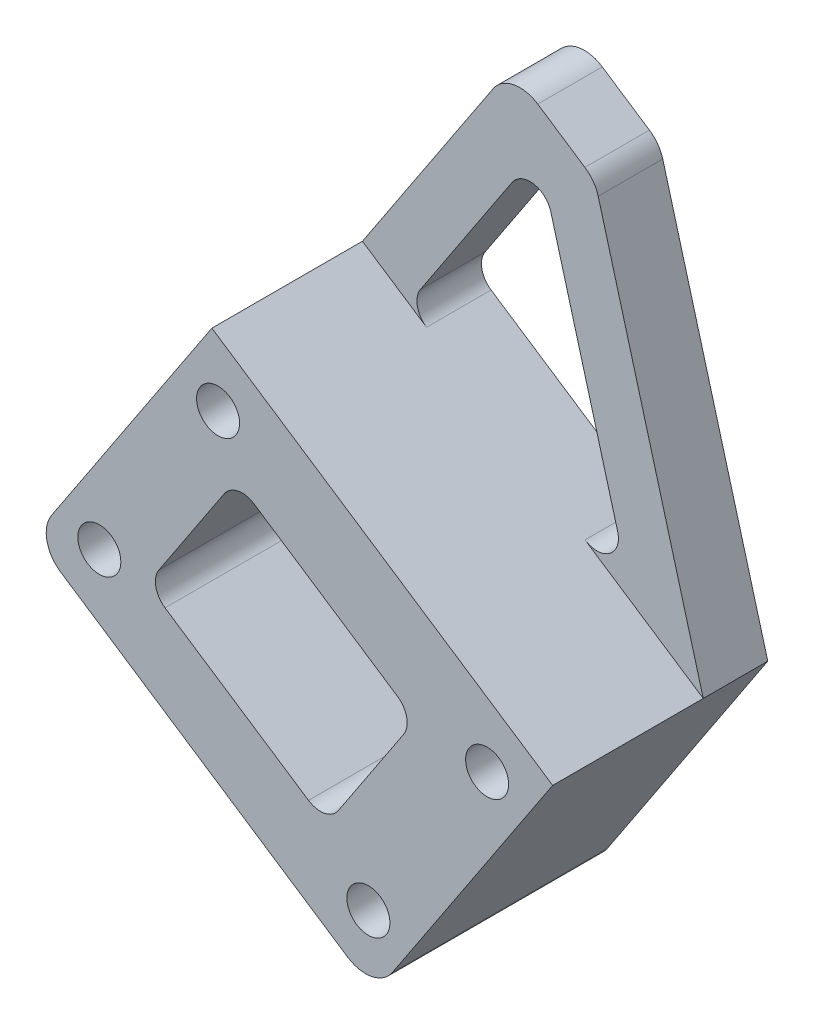
ISO-10303-21;
HEADER;
FILE_DESCRIPTION(('STEP AP214'),'2;1');
FILE_NAME('part.step','',(''),(''),'','','');
FILE_SCHEMA(('AUTOMOTIVE_DESIGN { 1 0 10303 214 1 1 1 1 }'));
ENDSEC;
DATA;
#1=APPLICATION_CONTEXT('core data for automotive mechanical design processes');
#2=APPLICATION_PROTOCOL_DEFINITION('international standard','automotive_design',2000,#1);
#3=PRODUCT_CONTEXT('',#1,'mechanical');
#4=PRODUCT('Part','Part','',(#3));
#5=PRODUCT_RELATED_PRODUCT_CATEGORY('part','',(#4));
#6=PRODUCT_DEFINITION_FORMATION('','',#4);
#7=PRODUCT_DEFINITION_CONTEXT('part definition',#1,'design');
#8=PRODUCT_DEFINITION('design','',#6,#7);
#9=PRODUCT_DEFINITION_SHAPE('','',#8);
#10=(LENGTH_UNIT() NAMED_UNIT(*) SI_UNIT(.MILLI.,.METRE.));
#11=(NAMED_UNIT(*) PLANE_ANGLE_UNIT() SI_UNIT($,.RADIAN.));
#12=(NAMED_UNIT(*) SI_UNIT($,.STERADIAN.) SOLID_ANGLE_UNIT());
#13=UNCERTAINTY_MEASURE_WITH_UNIT(LENGTH_MEASURE(1.E-05),#10,'distance_accuracy_value','');
#14=(GEOMETRIC_REPRESENTATION_CONTEXT(3) GLOBAL_UNCERTAINTY_ASSIGNED_CONTEXT((#13)) GLOBAL_UNIT_ASSIGNED_CONTEXT((#10,
#11,#12)) REPRESENTATION_CONTEXT('',''));
#15=CARTESIAN_POINT('',(0.,0.,0.));
#16=DIRECTION('',(0.,0.,1.));
#17=DIRECTION('',(1.,0.,0.));
#18=AXIS2_PLACEMENT_3D('',#15,#16,#17);
#19=CARTESIAN_POINT('',(23.5441511878888,-8.40208816576704,20.));
#20=DIRECTION('',(-0.964284087030584,-0.264870155924735,0.));
#21=DIRECTION('',(0.264870155924735,-0.964284087030584,0.));
#22=AXIS2_PLACEMENT_3D('',#19,#20,#21);
#23=PLANE('',#22);
#24=DIRECTION('',(-0.264870155924735,0.964284087030584,0.));
#25=VECTOR('',#24,1.);
#26=CARTESIAN_POINT('',(23.5441511878888,-8.40208816576704,6.));
#27=LINE('',#26,#25);
#28=CARTESIAN_POINT('',(23.5441511878888,-8.40208816576704,6.));
#29=VERTEX_POINT('',#28);
#30=CARTESIAN_POINT('',(13.7775427468694,27.154145306643,6.));
#31=VERTEX_POINT('',#30);
#32=EDGE_CURVE('E245',#29,#31,#27,.T.);
#33=ORIENTED_EDGE('',*,*,#32,.F.);
#34=DIRECTION('',(0.,0.,-1.));
#35=VECTOR('',#34,1.);
#36=CARTESIAN_POINT('',(23.5441511878888,-8.40208816576704,20.));
#37=LINE('',#36,#35);
#38=CARTESIAN_POINT('',(23.5441511878888,-8.40208816576704,0.));
#39=VERTEX_POINT('',#38);
#40=EDGE_CURVE('E411',#29,#39,#37,.T.);
#41=ORIENTED_EDGE('',*,*,#40,.T.);
#42=DIRECTION('',(-0.264870155924735,0.964284087030584,0.));
#43=VECTOR('',#42,1.);
#44=CARTESIAN_POINT('',(23.5441511878888,-8.40208816576704,0.));
#45=LINE('',#44,#43);
#46=CARTESIAN_POINT('',(13.7775427468694,27.154145306643,0.));
#47=VERTEX_POINT('',#46);
#48=EDGE_CURVE('E379',#39,#47,#45,.T.);
#49=ORIENTED_EDGE('',*,*,#48,.T.);
#50=DIRECTION('',(0.,0.,-1.));
#51=VECTOR('',#50,1.);
#52=CARTESIAN_POINT('',(13.7775427468694,27.154145306643,20.));
#53=LINE('',#52,#51);
#54=EDGE_CURVE('E410',#31,#47,#53,.T.);
#55=ORIENTED_EDGE('',*,*,#54,.F.);
#56=EDGE_LOOP('',(#33,#41,#49,#55));
#57=FACE_BOUND('',#56,.T.);
#58=ADVANCED_FACE('F41',(#57),#23,.F.);
#59=CARTESIAN_POINT('',(10.8846904857777,26.3595348388687,20.));
#60=DIRECTION('',(0.,0.,-1.));
#61=DIRECTION('',(-1.,0.,0.));
#62=AXIS2_PLACEMENT_3D('',#59,#60,#61);
#63=CYLINDRICAL_SURFACE('',#62,3.00000000000002);
#64=CARTESIAN_POINT('',(10.8846904857777,26.3595348388687,6.));
#65=DIRECTION('',(0.,0.,1.));
#66=DIRECTION('',(1.,0.,0.));
#67=AXIS2_PLACEMENT_3D('',#64,#65,#66);
#68=CIRCLE('',#67,3.00000000000002);
#69=CARTESIAN_POINT('',(12.5405014417147,28.8611923050697,6.));
#70=VERTEX_POINT('',#69);
#71=EDGE_CURVE('E243',#31,#70,#68,.T.);
#72=ORIENTED_EDGE('',*,*,#71,.F.);
#73=ORIENTED_EDGE('',*,*,#54,.T.);
#74=CARTESIAN_POINT('',(10.8846904857777,26.3595348388687,0.));
#75=DIRECTION('',(0.,0.,1.));
#76=DIRECTION('',(1.,0.,0.));
#77=AXIS2_PLACEMENT_3D('',#74,#75,#76);
#78=CIRCLE('',#77,3.00000000000002);
#79=CARTESIAN_POINT('',(12.5405014417147,28.8611923050697,0.));
#80=VERTEX_POINT('',#79);
#81=EDGE_CURVE('E382',#47,#80,#78,.T.);
#82=ORIENTED_EDGE('',*,*,#81,.T.);
#83=DIRECTION('',(0.,0.,-1.));
#84=VECTOR('',#83,1.);
#85=CARTESIAN_POINT('',(12.5405014417147,28.8611923050697,20.));
#86=LINE('',#85,#84);
#87=EDGE_CURVE('E408',#70,#80,#86,.T.);
#88=ORIENTED_EDGE('',*,*,#87,.F.);
#89=EDGE_LOOP('',(#72,#73,#82,#88));
#90=FACE_BOUND('',#89,.T.);
#91=ADVANCED_FACE('F432',(#90),#63,.T.);
#92=CARTESIAN_POINT('',(12.5405014417147,28.8611923050697,20.));
#93=DIRECTION('',(-0.551936985312337,-0.833885822066984,0.));
#94=DIRECTION('',(0.833885822066984,-0.551936985312337,0.));
#95=AXIS2_PLACEMENT_3D('',#92,#93,#94);
#96=PLANE('',#95);
#97=DIRECTION('',(-0.833885822066984,0.551936985312337,0.));
#98=VECTOR('',#97,1.);
#99=CARTESIAN_POINT('',(12.5405014417147,28.8611923050697,6.));
#100=LINE('',#99,#98);
#101=CARTESIAN_POINT('',(8.15657204835288,31.7628518718394,6.));
#102=VERTEX_POINT('',#101);
#103=EDGE_CURVE('E241',#70,#102,#100,.T.);
#104=ORIENTED_EDGE('',*,*,#103,.F.);
#105=ORIENTED_EDGE('',*,*,#87,.T.);
#106=DIRECTION('',(-0.833885822066983,0.551936985312337,0.));
#107=VECTOR('',#106,1.);
#108=CARTESIAN_POINT('',(12.5405014417147,28.8611923050697,0.));
#109=LINE('',#108,#107);
#110=CARTESIAN_POINT('',(8.15657204835288,31.7628518718394,0.));
#111=VERTEX_POINT('',#110);
#112=EDGE_CURVE('E385',#80,#111,#109,.T.);
#113=ORIENTED_EDGE('',*,*,#112,.T.);
#114=DIRECTION('',(0.,0.,-1.));
#115=VECTOR('',#114,1.);
#116=CARTESIAN_POINT('',(8.15657204835288,31.7628518718394,20.));
#117=LINE('',#116,#115);
#118=EDGE_CURVE('E406',#102,#111,#117,.T.);
#119=ORIENTED_EDGE('',*,*,#118,.F.);
#120=EDGE_LOOP('',(#104,#105,#113,#119));
#121=FACE_BOUND('',#120,.T.);
#122=ADVANCED_FACE('F436',(#121),#96,.F.);
#123=CARTESIAN_POINT('',(6.50076109241587,29.2611944056385,20.));
#124=DIRECTION('',(0.,0.,-1.));
#125=DIRECTION('',(-1.,0.,0.));
#126=AXIS2_PLACEMENT_3D('',#123,#124,#125);
#127=CYLINDRICAL_SURFACE('',#126,2.99999999999996);
#128=CARTESIAN_POINT('',(6.50076109241587,29.2611944056385,6.));
#129=DIRECTION('',(0.,0.,1.));
#130=DIRECTION('',(1.,0.,0.));
#131=AXIS2_PLACEMENT_3D('',#128,#129,#130);
#132=CIRCLE('',#131,2.99999999999996);
#133=CARTESIAN_POINT('',(3.99910362621493,30.9170053615754,6.));
#134=VERTEX_POINT('',#133);
#135=EDGE_CURVE('E208',#102,#134,#132,.T.);
#136=ORIENTED_EDGE('',*,*,#135,.F.);
#137=ORIENTED_EDGE('',*,*,#118,.T.);
#138=CARTESIAN_POINT('',(6.50076109241587,29.2611944056385,0.));
#139=DIRECTION('',(0.,0.,1.));
#140=DIRECTION('',(1.,0.,0.));
#141=AXIS2_PLACEMENT_3D('',#138,#139,#140);
#142=CIRCLE('',#141,2.99999999999996);
#143=CARTESIAN_POINT('',(3.99910362621494,30.9170053615754,0.));
#144=VERTEX_POINT('',#143);
#145=EDGE_CURVE('E388',#111,#144,#142,.T.);
#146=ORIENTED_EDGE('',*,*,#145,.T.);
#147=DIRECTION('',(0.,0.,-1.));
#148=VECTOR('',#147,1.);
#149=CARTESIAN_POINT('',(3.99910362621494,30.9170053615754,20.));
#150=LINE('',#149,#148);
#151=EDGE_CURVE('E404',#134,#144,#150,.T.);
#152=ORIENTED_EDGE('',*,*,#151,.F.);
#153=EDGE_LOOP('',(#136,#137,#146,#152));
#154=FACE_BOUND('',#153,.T.);
#155=ADVANCED_FACE('F438',(#154),#127,.T.);
#156=CARTESIAN_POINT('',(13.6578409145248,0.539927744348745,20.));
#157=DIRECTION('',(0.,0.,-1.));
#158=DIRECTION('',(-1.,0.,0.));
#159=AXIS2_PLACEMENT_3D('',#156,#157,#158);
#160=CYLINDRICAL_SURFACE('',#159,2.00000000000001);
#161=DIRECTION('',(0.,0.,-1.));
#162=VECTOR('',#161,1.);
#163=CARTESIAN_POINT('',(12.5539669439001,-1.12784389978526,20.));
#164=LINE('',#163,#162);
#165=CARTESIAN_POINT('',(12.5539669439001,-1.12784389978525,6.));
#166=VERTEX_POINT('',#165);
#167=CARTESIAN_POINT('',(12.5539669439001,-1.12784389978526,0.));
#168=VERTEX_POINT('',#167);
#169=EDGE_CURVE('E64',#166,#168,#164,.T.);
#170=ORIENTED_EDGE('',*,*,#169,.F.);
#171=CARTESIAN_POINT('',(13.6578409145248,0.539927744348745,6.));
#172=DIRECTION('',(0.,0.,1.));
#173=DIRECTION('',(1.,0.,0.));
#174=AXIS2_PLACEMENT_3D('',#171,#172,#173);
#175=CIRCLE('',#174,2.00000000000001);
#176=CARTESIAN_POINT('',(15.5864090885859,1.06966805619818,6.));
#177=VERTEX_POINT('',#176);
#178=EDGE_CURVE('E212',#166,#177,#175,.T.);
#179=ORIENTED_EDGE('',*,*,#178,.T.);
#180=DIRECTION('',(0.,0.,-1.));
#181=VECTOR('',#180,1.);
#182=CARTESIAN_POINT('',(15.5864090885859,1.06966805619818,20.));
#183=LINE('',#182,#181);
#184=CARTESIAN_POINT('',(15.5864090885859,1.06966805619818,0.));
#185=VERTEX_POINT('',#184);
#186=EDGE_CURVE('E281',#177,#185,#183,.T.);
#187=ORIENTED_EDGE('',*,*,#186,.T.);
#188=CARTESIAN_POINT('',(13.6578409145248,0.539927744348745,0.));
#189=DIRECTION('',(0.,0.,1.));
#190=DIRECTION('',(1.,0.,0.));
#191=AXIS2_PLACEMENT_3D('',#188,#189,#190);
#192=CIRCLE('',#191,2.00000000000001);
#193=EDGE_CURVE('E251',#168,#185,#192,.T.);
#194=ORIENTED_EDGE('',*,*,#193,.F.);
#195=EDGE_LOOP('',(#170,#179,#187,#194));
#196=FACE_BOUND('',#195,.T.);
#197=ADVANCED_FACE('F503',(#196),#160,.F.);
#198=CARTESIAN_POINT('',(15.5864090885859,1.06966805619818,20.));
#199=DIRECTION('',(-0.964284087030584,-0.264870155924734,0.));
#200=DIRECTION('',(0.264870155924734,-0.964284087030584,0.));
#201=AXIS2_PLACEMENT_3D('',#198,#199,#200);
#202=PLANE('',#201);
#203=ORIENTED_EDGE('',*,*,#186,.F.);
#204=DIRECTION('',(-0.264870155924734,0.964284087030584,0.));
#205=VECTOR('',#204,1.);
#206=CARTESIAN_POINT('',(15.5864090885859,1.06966805619818,6.));
#207=LINE('',#206,#205);
#208=CARTESIAN_POINT('',(9.37146421885764,23.6957446661818,6.));
#209=VERTEX_POINT('',#208);
#210=EDGE_CURVE('E235',#177,#209,#207,.T.);
#211=ORIENTED_EDGE('',*,*,#210,.T.);
#212=DIRECTION('',(0.,0.,-1.));
#213=VECTOR('',#212,1.);
#214=CARTESIAN_POINT('',(9.37146421885764,23.6957446661818,20.));
#215=LINE('',#214,#213);
#216=CARTESIAN_POINT('',(9.37146421885764,23.6957446661818,0.));
#217=VERTEX_POINT('',#216);
#218=EDGE_CURVE('E279',#209,#217,#215,.T.);
#219=ORIENTED_EDGE('',*,*,#218,.T.);
#220=DIRECTION('',(-0.264870155924734,0.964284087030584,0.));
#221=VECTOR('',#220,1.);
#222=CARTESIAN_POINT('',(15.5864090885859,1.06966805619818,0.));
#223=LINE('',#222,#221);
#224=EDGE_CURVE('E259',#185,#217,#223,.T.);
#225=ORIENTED_EDGE('',*,*,#224,.F.);
#226=EDGE_LOOP('',(#203,#211,#219,#225));
#227=FACE_BOUND('',#226,.T.);
#228=ADVANCED_FACE('F519',(#227),#202,.T.);
#229=CARTESIAN_POINT('',(7.44289604479648,23.1660043543324,20.));
#230=DIRECTION('',(0.,0.,-1.));
#231=DIRECTION('',(-1.,0.,0.));
#232=AXIS2_PLACEMENT_3D('',#229,#230,#231);
#233=CYLINDRICAL_SURFACE('',#232,2.);
#234=ORIENTED_EDGE('',*,*,#218,.F.);
#235=CARTESIAN_POINT('',(7.44289604479648,23.1660043543324,6.));
#236=DIRECTION('',(0.,0.,1.));
#237=DIRECTION('',(1.,0.,0.));
#238=AXIS2_PLACEMENT_3D('',#235,#236,#237);
#239=CIRCLE('',#238,2.);
#240=CARTESIAN_POINT('',(5.77512440066252,24.269878324957,6.));
#241=VERTEX_POINT('',#240);
#242=EDGE_CURVE('E232',#209,#241,#239,.T.);
#243=ORIENTED_EDGE('',*,*,#242,.T.);
#244=DIRECTION('',(0.,0.,-1.));
#245=VECTOR('',#244,1.);
#246=CARTESIAN_POINT('',(5.77512440066252,24.269878324957,20.));
#247=LINE('',#246,#245);
#248=CARTESIAN_POINT('',(5.77512440066252,24.269878324957,0.));
#249=VERTEX_POINT('',#248);
#250=EDGE_CURVE('E277',#241,#249,#247,.T.);
#251=ORIENTED_EDGE('',*,*,#250,.T.);
#252=CARTESIAN_POINT('',(7.44289604479648,23.1660043543324,0.));
#253=DIRECTION('',(0.,0.,1.));
#254=DIRECTION('',(1.,0.,0.));
#255=AXIS2_PLACEMENT_3D('',#252,#253,#254);
#256=CIRCLE('',#255,2.);
#257=EDGE_CURVE('E262',#217,#249,#256,.T.);
#258=ORIENTED_EDGE('',*,*,#257,.F.);
#259=EDGE_LOOP('',(#234,#243,#251,#258));
#260=FACE_BOUND('',#259,.T.);
#261=ADVANCED_FACE('F527',(#260),#233,.F.);
#262=CARTESIAN_POINT('',(5.77512440066252,24.269878324957,20.));
#263=DIRECTION('',(0.833885822066982,-0.55193698531234,0.));
#264=DIRECTION('',(0.55193698531234,0.833885822066982,0.));
#265=AXIS2_PLACEMENT_3D('',#262,#263,#264);
#266=PLANE('',#265);
#267=ORIENTED_EDGE('',*,*,#250,.F.);
#268=DIRECTION('',(-0.55193698531234,-0.833885822066982,0.));
#269=VECTOR('',#268,1.);
#270=CARTESIAN_POINT('',(5.77512440066252,24.269878324957,6.));
#271=LINE('',#270,#269);
#272=CARTESIAN_POINT('',(-2.74529604273651,11.3969272546833,6.));
#273=VERTEX_POINT('',#272);
#274=EDGE_CURVE('E227',#241,#273,#271,.T.);
#275=ORIENTED_EDGE('',*,*,#274,.T.);
#276=DIRECTION('',(0.,0.,-1.));
#277=VECTOR('',#276,1.);
#278=CARTESIAN_POINT('',(-2.74529604273651,11.3969272546833,20.));
#279=LINE('',#278,#277);
#280=CARTESIAN_POINT('',(-2.74529604273651,11.3969272546833,0.));
#281=VERTEX_POINT('',#280);
#282=EDGE_CURVE('E275',#273,#281,#279,.T.);
#283=ORIENTED_EDGE('',*,*,#282,.T.);
#284=DIRECTION('',(-0.55193698531234,-0.833885822066982,0.));
#285=VECTOR('',#284,1.);
#286=CARTESIAN_POINT('',(5.77512440066252,24.269878324957,0.));
#287=LINE('',#286,#285);
#288=EDGE_CURVE('E265',#249,#281,#287,.T.);
#289=ORIENTED_EDGE('',*,*,#288,.F.);
#290=EDGE_LOOP('',(#267,#275,#283,#289));
#291=FACE_BOUND('',#290,.T.);
#292=ADVANCED_FACE('F535',(#291),#266,.T.);
#293=CARTESIAN_POINT('',(-1.07752439860254,10.2930532840587,20.));
#294=DIRECTION('',(0.,0.,-1.));
#295=DIRECTION('',(-1.,0.,0.));
#296=AXIS2_PLACEMENT_3D('',#293,#294,#295);
#297=CYLINDRICAL_SURFACE('',#296,2.);
#298=ORIENTED_EDGE('',*,*,#282,.F.);
#299=CARTESIAN_POINT('',(-1.07752439860254,10.2930532840587,6.));
#300=DIRECTION('',(0.,0.,1.));
#301=DIRECTION('',(1.,0.,0.));
#302=AXIS2_PLACEMENT_3D('',#299,#300,#301);
#303=CIRCLE('',#302,2.);
#304=CARTESIAN_POINT('',(-2.18139836922723,8.62528163992471,6.));
#305=VERTEX_POINT('',#304);
#306=EDGE_CURVE('E225',#273,#305,#303,.T.);
#307=ORIENTED_EDGE('',*,*,#306,.T.);
#308=DIRECTION('',(0.,0.,-1.));
#309=VECTOR('',#308,1.);
#310=CARTESIAN_POINT('',(-2.18139836922723,8.62528163992471,20.));
#311=LINE('',#310,#309);
#312=CARTESIAN_POINT('',(-2.18139836922723,8.62528163992471,0.));
#313=VERTEX_POINT('',#312);
#314=EDGE_CURVE('E219',#305,#313,#311,.T.);
#315=ORIENTED_EDGE('',*,*,#314,.T.);
#316=CARTESIAN_POINT('',(-1.07752439860254,10.2930532840587,0.));
#317=DIRECTION('',(0.,0.,1.));
#318=DIRECTION('',(1.,0.,0.));
#319=AXIS2_PLACEMENT_3D('',#316,#317,#318);
#320=CIRCLE('',#319,2.);
#321=EDGE_CURVE('E268',#281,#313,#320,.T.);
#322=ORIENTED_EDGE('',*,*,#321,.F.);
#323=EDGE_LOOP('',(#298,#307,#315,#322));
#324=FACE_BOUND('',#323,.T.);
#325=ADVANCED_FACE('F456',(#324),#297,.F.);
#326=CARTESIAN_POINT('',(6.14019511825467,-29.2611944056386,20.));
#327=DIRECTION('',(0.,0.,1.));
#328=DIRECTION('',(1.,0.,0.));
#329=AXIS2_PLACEMENT_3D('',#326,#327,#328);
#330=PLANE('',#329);
#331=DIRECTION('',(0.833885822066982,-0.55193698531234,0.));
#332=VECTOR('',#331,1.);
#333=CARTESIAN_POINT('',(-2.18139836922723,8.62528163992471,20.));
#334=LINE('',#333,#332);
#335=CARTESIAN_POINT('',(-8.14351005065654,12.5715172761018,20.));
#336=VERTEX_POINT('',#335);
#337=CARTESIAN_POINT('',(23.5441511878888,-8.40208816576704,20.));
#338=VERTEX_POINT('',#337);
#339=EDGE_CURVE('E254',#336,#338,#334,.T.);
#340=ORIENTED_EDGE('',*,*,#339,.F.);
#341=DIRECTION('',(-0.55193698531234,-0.833885822066982,0.));
#342=VECTOR('',#341,1.);
#343=CARTESIAN_POINT('',(3.99910362621493,30.9170053615754,20.));
#344=LINE('',#343,#342);
#345=CARTESIAN_POINT('',(-23.0458086540897,-9.94339991970666,20.));
#346=VERTEX_POINT('',#345);
#347=EDGE_CURVE('E224',#336,#346,#344,.T.);
#348=ORIENTED_EDGE('',*,*,#347,.T.);
#349=CARTESIAN_POINT('',(-20.5441511878888,-11.5992108756437,20.));
#350=DIRECTION('',(0.,0.,1.));
#351=DIRECTION('',(1.,0.,0.));
#352=AXIS2_PLACEMENT_3D('',#349,#350,#351);
#353=CIRCLE('',#352,3.);
#354=CARTESIAN_POINT('',(-22.1999621438258,-14.1008683418446,20.));
#355=VERTEX_POINT('',#354);
#356=EDGE_CURVE('E369',#346,#355,#353,.T.);
#357=ORIENTED_EDGE('',*,*,#356,.T.);
#358=DIRECTION('',(0.833885822066982,-0.55193698531234,0.));
#359=VECTOR('',#358,1.);
#360=CARTESIAN_POINT('',(-22.1999621438258,-14.1008683418447,20.));
#361=LINE('',#360,#359);
#362=CARTESIAN_POINT('',(4.48438416231764,-31.7628518718395,20.));
#363=VERTEX_POINT('',#362);
#364=EDGE_CURVE('E371',#355,#363,#361,.T.);
#365=ORIENTED_EDGE('',*,*,#364,.T.);
#366=CARTESIAN_POINT('',(6.14019511825467,-29.2611944056386,20.));
#367=DIRECTION('',(0.,0.,1.));
#368=DIRECTION('',(1.,0.,0.));
#369=AXIS2_PLACEMENT_3D('',#366,#367,#368);
#370=CIRCLE('',#369,3.);
#371=CARTESIAN_POINT('',(8.64185258445563,-30.9170053615756,20.));
#372=VERTEX_POINT('',#371);
#373=EDGE_CURVE('E361',#363,#372,#370,.T.);
#374=ORIENTED_EDGE('',*,*,#373,.T.);
#375=DIRECTION('',(0.551936985312339,0.833885822066982,0.));
#376=VECTOR('',#375,1.);
#377=CARTESIAN_POINT('',(8.64185258445563,-30.9170053615756,20.));
#378=LINE('',#377,#376);
#379=EDGE_CURVE('E364',#372,#338,#378,.T.);
#380=ORIENTED_EDGE('',*,*,#379,.T.);
#381=EDGE_LOOP('',(#340,#348,#357,#365,#374,#380));
#382=FACE_BOUND('',#381,.T.);
#383=CARTESIAN_POINT('',(-18.6063913951971,-10.483376216822,20.));
#384=DIRECTION('',(0.,0.,1.));
#385=DIRECTION('',(1.,0.,0.));
#386=AXIS2_PLACEMENT_3D('',#383,#384,#385);
#387=CIRCLE('',#386,2.00000000000001);
#388=CARTESIAN_POINT('',(-16.6063913951971,-10.483376216822,20.));
#389=VERTEX_POINT('',#388);
#390=EDGE_CURVE('E284',#389,#389,#387,.T.);
#391=ORIENTED_EDGE('',*,*,#390,.F.);
#392=EDGE_LOOP('',(#391));
#393=FACE_BOUND('',#392,.T.);
#394=CARTESIAN_POINT('',(6.41018326681236,-27.0414857761923,20.));
#395=DIRECTION('',(0.,0.,1.));
#396=DIRECTION('',(1.,0.,0.));
#397=AXIS2_PLACEMENT_3D('',#394,#395,#396);
#398=CIRCLE('',#397,2.);
#399=CARTESIAN_POINT('',(8.41018326681236,-27.0414857761923,20.));
#400=VERTEX_POINT('',#399);
#401=EDGE_CURVE('E296',#400,#400,#398,.T.);
#402=ORIENTED_EDGE('',*,*,#401,.F.);
#403=EDGE_LOOP('',(#402));
#404=FACE_BOUND('',#403,.T.);
#405=DIRECTION('',(-0.833885822066983,0.551936985312338,0.));
#406=VECTOR('',#405,1.);
#407=CARTESIAN_POINT('',(9.12202544058627,-8.44993091855484,20.));
#408=LINE('',#407,#406);
#409=CARTESIAN_POINT('',(9.12202544058627,-8.44993091855484,20.));
#410=VERTEX_POINT('',#409);
#411=CARTESIAN_POINT('',(-4.22014771248545,0.381060846442562,20.));
#412=VERTEX_POINT('',#411);
#413=EDGE_CURVE('E304',#410,#412,#408,.T.);
#414=ORIENTED_EDGE('',*,*,#413,.F.);
#415=CARTESIAN_POINT('',(8.0181514699616,-10.1177025626888,20.));
#416=DIRECTION('',(0.,0.,1.));
#417=DIRECTION('',(1.,0.,0.));
#418=AXIS2_PLACEMENT_3D('',#415,#416,#417);
#419=CIRCLE('',#418,1.99999999999998);
#420=CARTESIAN_POINT('',(9.68592311409555,-11.2215765333135,20.));
#421=VERTEX_POINT('',#420);
#422=EDGE_CURVE('E302',#421,#410,#419,.T.);
#423=ORIENTED_EDGE('',*,*,#422,.F.);
#424=DIRECTION('',(0.551936985312339,0.833885822066982,0.));
#425=VECTOR('',#424,1.);
#426=CARTESIAN_POINT('',(3.61461627565982,-20.3943205760503,20.));
#427=LINE('',#426,#425);
#428=CARTESIAN_POINT('',(3.61461627565981,-20.3943205760503,20.));
#429=VERTEX_POINT('',#428);
#430=EDGE_CURVE('E318',#429,#421,#427,.T.);
#431=ORIENTED_EDGE('',*,*,#430,.F.);
#432=CARTESIAN_POINT('',(1.94684463152586,-19.2904466054256,20.));
#433=DIRECTION('',(0.,0.,1.));
#434=DIRECTION('',(1.,0.,0.));
#435=AXIS2_PLACEMENT_3D('',#432,#433,#434);
#436=CIRCLE('',#435,1.99999999999999);
#437=CARTESIAN_POINT('',(0.842970660901171,-20.9582182495596,20.));
#438=VERTEX_POINT('',#437);
#439=EDGE_CURVE('E315',#438,#429,#436,.T.);
#440=ORIENTED_EDGE('',*,*,#439,.F.);
#441=DIRECTION('',(0.833885822066983,-0.551936985312338,0.));
#442=VECTOR('',#441,1.);
#443=CARTESIAN_POINT('',(-12.4992024921705,-12.1272264845622,20.));
#444=LINE('',#443,#442);
#445=CARTESIAN_POINT('',(-12.4992024921705,-12.1272264845622,20.));
#446=VERTEX_POINT('',#445);
#447=EDGE_CURVE('E313',#446,#438,#444,.T.);
#448=ORIENTED_EDGE('',*,*,#447,.F.);
#449=CARTESIAN_POINT('',(-11.3953285215458,-10.4594548404282,20.));
#450=DIRECTION('',(0.,0.,1.));
#451=DIRECTION('',(1.,0.,0.));
#452=AXIS2_PLACEMENT_3D('',#449,#450,#451);
#453=CIRCLE('',#452,2.00000000000004);
#454=CARTESIAN_POINT('',(-13.0631001656798,-9.35558086980347,20.));
#455=VERTEX_POINT('',#454);
#456=EDGE_CURVE('E311',#455,#446,#453,.T.);
#457=ORIENTED_EDGE('',*,*,#456,.F.);
#458=DIRECTION('',(-0.551936985312342,-0.83388582206698,0.));
#459=VECTOR('',#458,1.);
#460=CARTESIAN_POINT('',(-6.99179332724409,-0.182836827066712,20.));
#461=LINE('',#460,#459);
#462=CARTESIAN_POINT('',(-6.99179332724409,-0.182836827066712,20.));
#463=VERTEX_POINT('',#462);
#464=EDGE_CURVE('E309',#463,#455,#461,.T.);
#465=ORIENTED_EDGE('',*,*,#464,.F.);
#466=CARTESIAN_POINT('',(-5.32402168311014,-1.28671079769138,20.));
#467=DIRECTION('',(0.,0.,1.));
#468=DIRECTION('',(1.,0.,0.));
#469=AXIS2_PLACEMENT_3D('',#466,#467,#468);
#470=CIRCLE('',#469,1.99999999999999);
#471=EDGE_CURVE('E307',#412,#463,#470,.T.);
#472=ORIENTED_EDGE('',*,*,#471,.F.);
#473=EDGE_LOOP('',(#414,#423,#431,#440,#448,#457,#465,#472));
#474=FACE_BOUND('',#473,.T.);
#475=CARTESIAN_POINT('',(17.4489229730591,-10.3637693348526,20.));
#476=DIRECTION('',(0.,0.,1.));
#477=DIRECTION('',(1.,0.,0.));
#478=AXIS2_PLACEMENT_3D('',#475,#476,#477);
#479=CIRCLE('',#478,1.99999999999999);
#480=CARTESIAN_POINT('',(19.4489229730591,-10.3637693348526,20.));
#481=VERTEX_POINT('',#480);
#482=EDGE_CURVE('E290',#481,#481,#479,.T.);
#483=ORIENTED_EDGE('',*,*,#482,.F.);
#484=EDGE_LOOP('',(#483));
#485=FACE_BOUND('',#484,.T.);
#486=CARTESIAN_POINT('',(-7.56765168895032,6.19434022451759,20.));
#487=DIRECTION('',(0.,0.,1.));
#488=DIRECTION('',(1.,0.,0.));
#489=AXIS2_PLACEMENT_3D('',#486,#487,#488);
#490=CIRCLE('',#489,2.);
#491=CARTESIAN_POINT('',(-5.56765168895033,6.19434022451759,20.));
#492=VERTEX_POINT('',#491);
#493=EDGE_CURVE('E248',#492,#492,#490,.T.);
#494=ORIENTED_EDGE('',*,*,#493,.F.);
#495=EDGE_LOOP('',(#494));
#496=FACE_BOUND('',#495,.T.);
#497=ADVANCED_FACE('F453',(#382,#393,#404,#474,#485,#496),#330,.T.);
#498=CARTESIAN_POINT('',(6.14019511825467,-29.2611944056386,0.));
#499=DIRECTION('',(0.,0.,1.));
#500=DIRECTION('',(1.,0.,0.));
#501=AXIS2_PLACEMENT_3D('',#498,#499,#500);
#502=PLANE('',#501);
#503=CARTESIAN_POINT('',(-18.6063913951971,-10.483376216822,0.));
#504=DIRECTION('',(0.,0.,1.));
#505=DIRECTION('',(1.,0.,0.));
#506=AXIS2_PLACEMENT_3D('',#503,#504,#505);
#507=CIRCLE('',#506,2.00000000000001);
#508=CARTESIAN_POINT('',(-16.6063913951971,-10.483376216822,0.));
#509=VERTEX_POINT('',#508);
#510=EDGE_CURVE('E283',#509,#509,#507,.T.);
#511=ORIENTED_EDGE('',*,*,#510,.T.);
#512=EDGE_LOOP('',(#511));
#513=FACE_BOUND('',#512,.T.);
#514=CARTESIAN_POINT('',(17.4489229730591,-10.3637693348526,0.));
#515=DIRECTION('',(0.,0.,1.));
#516=DIRECTION('',(1.,0.,0.));
#517=AXIS2_PLACEMENT_3D('',#514,#515,#516);
#518=CIRCLE('',#517,1.99999999999999);
#519=CARTESIAN_POINT('',(19.4489229730591,-10.3637693348526,0.));
#520=VERTEX_POINT('',#519);
#521=EDGE_CURVE('E287',#520,#520,#518,.T.);
#522=ORIENTED_EDGE('',*,*,#521,.T.);
#523=EDGE_LOOP('',(#522));
#524=FACE_BOUND('',#523,.T.);
#525=CARTESIAN_POINT('',(6.41018326681236,-27.0414857761923,0.));
#526=DIRECTION('',(0.,0.,1.));
#527=DIRECTION('',(1.,0.,0.));
#528=AXIS2_PLACEMENT_3D('',#525,#526,#527);
#529=CIRCLE('',#528,2.);
#530=CARTESIAN_POINT('',(8.41018326681236,-27.0414857761923,0.));
#531=VERTEX_POINT('',#530);
#532=EDGE_CURVE('E293',#531,#531,#529,.T.);
#533=ORIENTED_EDGE('',*,*,#532,.T.);
#534=EDGE_LOOP('',(#533));
#535=FACE_BOUND('',#534,.T.);
#536=CARTESIAN_POINT('',(8.0181514699616,-10.1177025626888,0.));
#537=DIRECTION('',(0.,0.,1.));
#538=DIRECTION('',(1.,0.,0.));
#539=AXIS2_PLACEMENT_3D('',#536,#537,#538);
#540=CIRCLE('',#539,1.99999999999998);
#541=CARTESIAN_POINT('',(9.68592311409555,-11.2215765333135,0.));
#542=VERTEX_POINT('',#541);
#543=CARTESIAN_POINT('',(9.12202544058627,-8.44993091855484,0.));
#544=VERTEX_POINT('',#543);
#545=EDGE_CURVE('E299',#542,#544,#540,.T.);
#546=ORIENTED_EDGE('',*,*,#545,.T.);
#547=DIRECTION('',(-0.833885822066983,0.551936985312338,0.));
#548=VECTOR('',#547,1.);
#549=CARTESIAN_POINT('',(9.12202544058627,-8.44993091855484,0.));
#550=LINE('',#549,#548);
#551=CARTESIAN_POINT('',(-4.22014771248545,0.381060846442562,0.));
#552=VERTEX_POINT('',#551);
#553=EDGE_CURVE('E323',#544,#552,#550,.T.);
#554=ORIENTED_EDGE('',*,*,#553,.T.);
#555=CARTESIAN_POINT('',(-5.32402168311014,-1.28671079769138,0.));
#556=DIRECTION('',(0.,0.,1.));
#557=DIRECTION('',(1.,0.,0.));
#558=AXIS2_PLACEMENT_3D('',#555,#556,#557);
#559=CIRCLE('',#558,1.99999999999999);
#560=CARTESIAN_POINT('',(-6.99179332724409,-0.182836827066712,0.));
#561=VERTEX_POINT('',#560);
#562=EDGE_CURVE('E326',#552,#561,#559,.T.);
#563=ORIENTED_EDGE('',*,*,#562,.T.);
#564=DIRECTION('',(-0.551936985312342,-0.83388582206698,0.));
#565=VECTOR('',#564,1.);
#566=CARTESIAN_POINT('',(-6.99179332724409,-0.182836827066712,0.));
#567=LINE('',#566,#565);
#568=CARTESIAN_POINT('',(-13.0631001656798,-9.35558086980347,0.));
#569=VERTEX_POINT('',#568);
#570=EDGE_CURVE('E329',#561,#569,#567,.T.);
#571=ORIENTED_EDGE('',*,*,#570,.T.);
#572=CARTESIAN_POINT('',(-11.3953285215458,-10.4594548404282,0.));
#573=DIRECTION('',(0.,0.,1.));
#574=DIRECTION('',(1.,0.,0.));
#575=AXIS2_PLACEMENT_3D('',#572,#573,#574);
#576=CIRCLE('',#575,2.00000000000004);
#577=CARTESIAN_POINT('',(-12.4992024921705,-12.1272264845622,0.));
#578=VERTEX_POINT('',#577);
#579=EDGE_CURVE('E332',#569,#578,#576,.T.);
#580=ORIENTED_EDGE('',*,*,#579,.T.);
#581=DIRECTION('',(0.833885822066983,-0.551936985312338,0.));
#582=VECTOR('',#581,1.);
#583=CARTESIAN_POINT('',(-12.4992024921705,-12.1272264845622,0.));
#584=LINE('',#583,#582);
#585=CARTESIAN_POINT('',(0.842970660901171,-20.9582182495596,0.));
#586=VERTEX_POINT('',#585);
#587=EDGE_CURVE('E335',#578,#586,#584,.T.);
#588=ORIENTED_EDGE('',*,*,#587,.T.);
#589=CARTESIAN_POINT('',(1.94684463152586,-19.2904466054256,0.));
#590=DIRECTION('',(0.,0.,1.));
#591=DIRECTION('',(1.,0.,0.));
#592=AXIS2_PLACEMENT_3D('',#589,#590,#591);
#593=CIRCLE('',#592,1.99999999999999);
#594=CARTESIAN_POINT('',(3.61461627565982,-20.3943205760503,0.));
#595=VERTEX_POINT('',#594);
#596=EDGE_CURVE('E338',#586,#595,#593,.T.);
#597=ORIENTED_EDGE('',*,*,#596,.T.);
#598=DIRECTION('',(0.551936985312339,0.833885822066982,0.));
#599=VECTOR('',#598,1.);
#600=CARTESIAN_POINT('',(3.61461627565982,-20.3943205760503,0.));
#601=LINE('',#600,#599);
#602=EDGE_CURVE('E305',#595,#542,#601,.T.);
#603=ORIENTED_EDGE('',*,*,#602,.T.);
#604=EDGE_LOOP('',(#546,#554,#563,#571,#580,#588,#597,#603));
#605=FACE_BOUND('',#604,.T.);
#606=CARTESIAN_POINT('',(6.14019511825467,-29.2611944056386,0.));
#607=DIRECTION('',(0.,0.,1.));
#608=DIRECTION('',(1.,0.,0.));
#609=AXIS2_PLACEMENT_3D('',#606,#607,#608);
#610=CIRCLE('',#609,3.);
#611=CARTESIAN_POINT('',(4.48438416231764,-31.7628518718395,0.));
#612=VERTEX_POINT('',#611);
#613=CARTESIAN_POINT('',(8.64185258445563,-30.9170053615756,0.));
#614=VERTEX_POINT('',#613);
#615=EDGE_CURVE('E360',#612,#614,#610,.T.);
#616=ORIENTED_EDGE('',*,*,#615,.F.);
#617=DIRECTION('',(0.833885822066982,-0.55193698531234,0.));
#618=VECTOR('',#617,1.);
#619=CARTESIAN_POINT('',(-22.1999621438258,-14.1008683418447,0.));
#620=LINE('',#619,#618);
#621=CARTESIAN_POINT('',(-22.1999621438258,-14.1008683418446,0.));
#622=VERTEX_POINT('',#621);
#623=EDGE_CURVE('E365',#622,#612,#620,.T.);
#624=ORIENTED_EDGE('',*,*,#623,.F.);
#625=CARTESIAN_POINT('',(-20.5441511878888,-11.5992108756437,0.));
#626=DIRECTION('',(0.,0.,1.));
#627=DIRECTION('',(1.,0.,0.));
#628=AXIS2_PLACEMENT_3D('',#625,#626,#627);
#629=CIRCLE('',#628,3.);
#630=CARTESIAN_POINT('',(-23.0458086540897,-9.94339991970666,0.));
#631=VERTEX_POINT('',#630);
#632=EDGE_CURVE('E393',#631,#622,#629,.T.);
#633=ORIENTED_EDGE('',*,*,#632,.F.);
#634=DIRECTION('',(-0.55193698531234,-0.833885822066982,0.));
#635=VECTOR('',#634,1.);
#636=CARTESIAN_POINT('',(3.99910362621493,30.9170053615754,0.));
#637=LINE('',#636,#635);
#638=EDGE_CURVE('E391',#144,#631,#637,.T.);
#639=ORIENTED_EDGE('',*,*,#638,.F.);
#640=ORIENTED_EDGE('',*,*,#145,.F.);
#641=ORIENTED_EDGE('',*,*,#112,.F.);
#642=ORIENTED_EDGE('',*,*,#81,.F.);
#643=ORIENTED_EDGE('',*,*,#48,.F.);
#644=DIRECTION('',(0.551936985312339,0.833885822066982,0.));
#645=VECTOR('',#644,1.);
#646=CARTESIAN_POINT('',(8.64185258445563,-30.9170053615756,0.));
#647=LINE('',#646,#645);
#648=EDGE_CURVE('E376',#614,#39,#647,.T.);
#649=ORIENTED_EDGE('',*,*,#648,.F.);
#650=EDGE_LOOP('',(#616,#624,#633,#639,#640,#641,#642,#643,#649));
#651=FACE_BOUND('',#650,.T.);
#652=ORIENTED_EDGE('',*,*,#193,.T.);
#653=ORIENTED_EDGE('',*,*,#224,.T.);
#654=ORIENTED_EDGE('',*,*,#257,.T.);
#655=ORIENTED_EDGE('',*,*,#288,.T.);
#656=ORIENTED_EDGE('',*,*,#321,.T.);
#657=DIRECTION('',(0.833885822066982,-0.55193698531234,0.));
#658=VECTOR('',#657,1.);
#659=CARTESIAN_POINT('',(-2.18139836922723,8.62528163992471,0.));
#660=LINE('',#659,#658);
#661=EDGE_CURVE('E256',#313,#168,#660,.T.);
#662=ORIENTED_EDGE('',*,*,#661,.T.);
#663=EDGE_LOOP('',(#652,#653,#654,#655,#656,#662));
#664=FACE_BOUND('',#663,.T.);
#665=CARTESIAN_POINT('',(-7.56765168895032,6.19434022451759,0.));
#666=DIRECTION('',(0.,0.,1.));
#667=DIRECTION('',(1.,0.,0.));
#668=AXIS2_PLACEMENT_3D('',#665,#666,#667);
#669=CIRCLE('',#668,2.);
#670=CARTESIAN_POINT('',(-5.56765168895033,6.19434022451759,0.));
#671=VERTEX_POINT('',#670);
#672=EDGE_CURVE('E247',#671,#671,#669,.T.);
#673=ORIENTED_EDGE('',*,*,#672,.T.);
#674=EDGE_LOOP('',(#673));
#675=FACE_BOUND('',#674,.T.);
#676=ADVANCED_FACE('F425',(#513,#524,#535,#605,#651,#664,#675),#502,.F.);
#677=CARTESIAN_POINT('',(6.14019511825467,-29.2611944056386,20.));
#678=DIRECTION('',(0.,0.,-1.));
#679=DIRECTION('',(-1.,0.,0.));
#680=AXIS2_PLACEMENT_3D('',#677,#678,#679);
#681=CYLINDRICAL_SURFACE('',#680,3.);
#682=ORIENTED_EDGE('',*,*,#615,.T.);
#683=DIRECTION('',(0.,0.,-1.));
#684=VECTOR('',#683,1.);
#685=CARTESIAN_POINT('',(8.64185258445563,-30.9170053615756,20.));
#686=LINE('',#685,#684);
#687=EDGE_CURVE('E11',#372,#614,#686,.T.);
#688=ORIENTED_EDGE('',*,*,#687,.F.);
#689=ORIENTED_EDGE('',*,*,#373,.F.);
#690=DIRECTION('',(0.,0.,-1.));
#691=VECTOR('',#690,1.);
#692=CARTESIAN_POINT('',(4.48438416231764,-31.7628518718395,20.));
#693=LINE('',#692,#691);
#694=EDGE_CURVE('E373',#363,#612,#693,.T.);
#695=ORIENTED_EDGE('',*,*,#694,.T.);
#696=EDGE_LOOP('',(#682,#688,#689,#695));
#697=FACE_BOUND('',#696,.T.);
#698=ADVANCED_FACE('F43',(#697),#681,.T.);
#699=CARTESIAN_POINT('',(8.64185258445563,-30.9170053615756,20.));
#700=DIRECTION('',(-0.833885822066982,0.551936985312339,0.));
#701=DIRECTION('',(-0.551936985312339,-0.833885822066982,0.));
#702=AXIS2_PLACEMENT_3D('',#699,#700,#701);
#703=PLANE('',#702);
#704=ORIENTED_EDGE('',*,*,#648,.T.);
#705=ORIENTED_EDGE('',*,*,#40,.F.);
#706=EDGE_CURVE('E49',#338,#29,#37,.T.);
#707=ORIENTED_EDGE('',*,*,#706,.F.);
#708=ORIENTED_EDGE('',*,*,#379,.F.);
#709=ORIENTED_EDGE('',*,*,#687,.T.);
#710=EDGE_LOOP('',(#704,#705,#707,#708,#709));
#711=FACE_BOUND('',#710,.T.);
#712=ADVANCED_FACE('F421',(#711),#703,.F.);
#713=CARTESIAN_POINT('',(3.99910362621493,30.9170053615754,20.));
#714=DIRECTION('',(0.833885822066982,-0.55193698531234,0.));
#715=DIRECTION('',(0.55193698531234,0.833885822066982,0.));
#716=AXIS2_PLACEMENT_3D('',#713,#714,#715);
#717=PLANE('',#716);
#718=ORIENTED_EDGE('',*,*,#347,.F.);
#719=DIRECTION('',(0.,0.,1.));
#720=VECTOR('',#719,1.);
#721=CARTESIAN_POINT('',(-8.14351005065654,12.5715172761018,6.));
#722=LINE('',#721,#720);
#723=CARTESIAN_POINT('',(-8.14351005065654,12.5715172761018,6.));
#724=VERTEX_POINT('',#723);
#725=EDGE_CURVE('E217',#724,#336,#722,.T.);
#726=ORIENTED_EDGE('',*,*,#725,.F.);
#727=DIRECTION('',(-0.55193698531234,-0.833885822066982,0.));
#728=VECTOR('',#727,1.);
#729=CARTESIAN_POINT('',(3.99910362621493,30.9170053615754,6.));
#730=LINE('',#729,#728);
#731=EDGE_CURVE('E205',#134,#724,#730,.T.);
#732=ORIENTED_EDGE('',*,*,#731,.F.);
#733=ORIENTED_EDGE('',*,*,#151,.T.);
#734=ORIENTED_EDGE('',*,*,#638,.T.);
#735=DIRECTION('',(0.,0.,-1.));
#736=VECTOR('',#735,1.);
#737=CARTESIAN_POINT('',(-23.0458086540897,-9.94339991970666,20.));
#738=LINE('',#737,#736);
#739=EDGE_CURVE('E401',#346,#631,#738,.T.);
#740=ORIENTED_EDGE('',*,*,#739,.F.);
#741=EDGE_LOOP('',(#718,#726,#732,#733,#734,#740));
#742=FACE_BOUND('',#741,.T.);
#743=ADVANCED_FACE('F222',(#742),#717,.F.);
#744=CARTESIAN_POINT('',(-20.5441511878888,-11.5992108756437,20.));
#745=DIRECTION('',(0.,0.,-1.));
#746=DIRECTION('',(-1.,0.,0.));
#747=AXIS2_PLACEMENT_3D('',#744,#745,#746);
#748=CYLINDRICAL_SURFACE('',#747,3.);
#749=ORIENTED_EDGE('',*,*,#632,.T.);
#750=DIRECTION('',(0.,0.,-1.));
#751=VECTOR('',#750,1.);
#752=CARTESIAN_POINT('',(-22.1999621438258,-14.1008683418446,20.));
#753=LINE('',#752,#751);
#754=EDGE_CURVE('E398',#355,#622,#753,.T.);
#755=ORIENTED_EDGE('',*,*,#754,.F.);
#756=ORIENTED_EDGE('',*,*,#356,.F.);
#757=ORIENTED_EDGE('',*,*,#739,.T.);
#758=EDGE_LOOP('',(#749,#755,#756,#757));
#759=FACE_BOUND('',#758,.T.);
#760=ADVANCED_FACE('F443',(#759),#748,.T.);
#761=CARTESIAN_POINT('',(-22.1999621438258,-14.1008683418447,20.));
#762=DIRECTION('',(0.55193698531234,0.833885822066982,0.));
#763=DIRECTION('',(-0.833885822066982,0.55193698531234,0.));
#764=AXIS2_PLACEMENT_3D('',#761,#762,#763);
#765=PLANE('',#764);
#766=ORIENTED_EDGE('',*,*,#623,.T.);
#767=ORIENTED_EDGE('',*,*,#694,.F.);
#768=ORIENTED_EDGE('',*,*,#364,.F.);
#769=ORIENTED_EDGE('',*,*,#754,.T.);
#770=EDGE_LOOP('',(#766,#767,#768,#769));
#771=FACE_BOUND('',#770,.T.);
#772=ADVANCED_FACE('F448',(#771),#765,.F.);
#773=CARTESIAN_POINT('',(8.0181514699616,-10.1177025626888,20.));
#774=DIRECTION('',(0.,0.,-1.));
#775=DIRECTION('',(-1.,0.,0.));
#776=AXIS2_PLACEMENT_3D('',#773,#774,#775);
#777=CYLINDRICAL_SURFACE('',#776,1.99999999999998);
#778=ORIENTED_EDGE('',*,*,#545,.F.);
#779=DIRECTION('',(0.,0.,-1.));
#780=VECTOR('',#779,1.);
#781=CARTESIAN_POINT('',(9.68592311409555,-11.2215765333135,20.));
#782=LINE('',#781,#780);
#783=EDGE_CURVE('E320',#421,#542,#782,.T.);
#784=ORIENTED_EDGE('',*,*,#783,.F.);
#785=ORIENTED_EDGE('',*,*,#422,.T.);
#786=DIRECTION('',(0.,0.,-1.));
#787=VECTOR('',#786,1.);
#788=CARTESIAN_POINT('',(9.12202544058627,-8.44993091855484,20.));
#789=LINE('',#788,#787);
#790=EDGE_CURVE('E357',#410,#544,#789,.T.);
#791=ORIENTED_EDGE('',*,*,#790,.T.);
#792=EDGE_LOOP('',(#778,#784,#785,#791));
#793=FACE_BOUND('',#792,.T.);
#794=ADVANCED_FACE('F590',(#793),#777,.F.);
#795=CARTESIAN_POINT('',(9.12202544058627,-8.44993091855484,20.));
#796=DIRECTION('',(-0.551936985312338,-0.833885822066983,0.));
#797=DIRECTION('',(0.833885822066983,-0.551936985312338,0.));
#798=AXIS2_PLACEMENT_3D('',#795,#796,#797);
#799=PLANE('',#798);
#800=ORIENTED_EDGE('',*,*,#553,.F.);
#801=ORIENTED_EDGE('',*,*,#790,.F.);
#802=ORIENTED_EDGE('',*,*,#413,.T.);
#803=DIRECTION('',(0.,0.,-1.));
#804=VECTOR('',#803,1.);
#805=CARTESIAN_POINT('',(-4.22014771248545,0.381060846442562,20.));
#806=LINE('',#805,#804);
#807=EDGE_CURVE('E355',#412,#552,#806,.T.);
#808=ORIENTED_EDGE('',*,*,#807,.T.);
#809=EDGE_LOOP('',(#800,#801,#802,#808));
#810=FACE_BOUND('',#809,.T.);
#811=ADVANCED_FACE('F598',(#810),#799,.T.);
#812=CARTESIAN_POINT('',(-5.32402168311014,-1.28671079769138,20.));
#813=DIRECTION('',(0.,0.,-1.));
#814=DIRECTION('',(-1.,0.,0.));
#815=AXIS2_PLACEMENT_3D('',#812,#813,#814);
#816=CYLINDRICAL_SURFACE('',#815,1.99999999999999);
#817=ORIENTED_EDGE('',*,*,#562,.F.);
#818=ORIENTED_EDGE('',*,*,#807,.F.);
#819=ORIENTED_EDGE('',*,*,#471,.T.);
#820=DIRECTION('',(0.,0.,-1.));
#821=VECTOR('',#820,1.);
#822=CARTESIAN_POINT('',(-6.99179332724409,-0.182836827066712,20.));
#823=LINE('',#822,#821);
#824=EDGE_CURVE('E353',#463,#561,#823,.T.);
#825=ORIENTED_EDGE('',*,*,#824,.T.);
#826=EDGE_LOOP('',(#817,#818,#819,#825));
#827=FACE_BOUND('',#826,.T.);
#828=ADVANCED_FACE('F608',(#827),#816,.F.);
#829=CARTESIAN_POINT('',(-6.99179332724409,-0.182836827066712,20.));
#830=DIRECTION('',(0.83388582206698,-0.551936985312342,0.));
#831=DIRECTION('',(0.551936985312342,0.83388582206698,0.));
#832=AXIS2_PLACEMENT_3D('',#829,#830,#831);
#833=PLANE('',#832);
#834=ORIENTED_EDGE('',*,*,#570,.F.);
#835=ORIENTED_EDGE('',*,*,#824,.F.);
#836=ORIENTED_EDGE('',*,*,#464,.T.);
#837=DIRECTION('',(0.,0.,-1.));
#838=VECTOR('',#837,1.);
#839=CARTESIAN_POINT('',(-13.0631001656798,-9.35558086980347,20.));
#840=LINE('',#839,#838);
#841=EDGE_CURVE('E351',#455,#569,#840,.T.);
#842=ORIENTED_EDGE('',*,*,#841,.T.);
#843=EDGE_LOOP('',(#834,#835,#836,#842));
#844=FACE_BOUND('',#843,.T.);
#845=ADVANCED_FACE('F618',(#844),#833,.T.);
#846=CARTESIAN_POINT('',(-11.3953285215458,-10.4594548404282,20.));
#847=DIRECTION('',(0.,0.,-1.));
#848=DIRECTION('',(-1.,0.,0.));
#849=AXIS2_PLACEMENT_3D('',#846,#847,#848);
#850=CYLINDRICAL_SURFACE('',#849,2.00000000000004);
#851=ORIENTED_EDGE('',*,*,#579,.F.);
#852=ORIENTED_EDGE('',*,*,#841,.F.);
#853=ORIENTED_EDGE('',*,*,#456,.T.);
#854=DIRECTION('',(0.,0.,-1.));
#855=VECTOR('',#854,1.);
#856=CARTESIAN_POINT('',(-12.4992024921705,-12.1272264845622,20.));
#857=LINE('',#856,#855);
#858=EDGE_CURVE('E349',#446,#578,#857,.T.);
#859=ORIENTED_EDGE('',*,*,#858,.T.);
#860=EDGE_LOOP('',(#851,#852,#853,#859));
#861=FACE_BOUND('',#860,.T.);
#862=ADVANCED_FACE('F628',(#861),#850,.F.);
#863=CARTESIAN_POINT('',(-12.4992024921705,-12.1272264845622,20.));
#864=DIRECTION('',(0.551936985312338,0.833885822066983,0.));
#865=DIRECTION('',(-0.833885822066983,0.551936985312338,0.));
#866=AXIS2_PLACEMENT_3D('',#863,#864,#865);
#867=PLANE('',#866);
#868=ORIENTED_EDGE('',*,*,#587,.F.);
#869=ORIENTED_EDGE('',*,*,#858,.F.);
#870=ORIENTED_EDGE('',*,*,#447,.T.);
#871=DIRECTION('',(0.,0.,-1.));
#872=VECTOR('',#871,1.);
#873=CARTESIAN_POINT('',(0.842970660901171,-20.9582182495596,20.));
#874=LINE('',#873,#872);
#875=EDGE_CURVE('E347',#438,#586,#874,.T.);
#876=ORIENTED_EDGE('',*,*,#875,.T.);
#877=EDGE_LOOP('',(#868,#869,#870,#876));
#878=FACE_BOUND('',#877,.T.);
#879=ADVANCED_FACE('F638',(#878),#867,.T.);
#880=CARTESIAN_POINT('',(1.94684463152586,-19.2904466054256,20.));
#881=DIRECTION('',(0.,0.,-1.));
#882=DIRECTION('',(-1.,0.,0.));
#883=AXIS2_PLACEMENT_3D('',#880,#881,#882);
#884=CYLINDRICAL_SURFACE('',#883,1.99999999999999);
#885=ORIENTED_EDGE('',*,*,#596,.F.);
#886=ORIENTED_EDGE('',*,*,#875,.F.);
#887=ORIENTED_EDGE('',*,*,#439,.T.);
#888=DIRECTION('',(0.,0.,-1.));
#889=VECTOR('',#888,1.);
#890=CARTESIAN_POINT('',(3.61461627565982,-20.3943205760503,20.));
#891=LINE('',#890,#889);
#892=EDGE_CURVE('E345',#429,#595,#891,.T.);
#893=ORIENTED_EDGE('',*,*,#892,.T.);
#894=EDGE_LOOP('',(#885,#886,#887,#893));
#895=FACE_BOUND('',#894,.T.);
#896=ADVANCED_FACE('F648',(#895),#884,.F.);
#897=CARTESIAN_POINT('',(3.61461627565982,-20.3943205760503,20.));
#898=DIRECTION('',(-0.833885822066983,0.551936985312339,0.));
#899=DIRECTION('',(-0.551936985312339,-0.833885822066983,0.));
#900=AXIS2_PLACEMENT_3D('',#897,#898,#899);
#901=PLANE('',#900);
#902=ORIENTED_EDGE('',*,*,#602,.F.);
#903=ORIENTED_EDGE('',*,*,#892,.F.);
#904=ORIENTED_EDGE('',*,*,#430,.T.);
#905=ORIENTED_EDGE('',*,*,#783,.T.);
#906=EDGE_LOOP('',(#902,#903,#904,#905));
#907=FACE_BOUND('',#906,.T.);
#908=ADVANCED_FACE('F658',(#907),#901,.T.);
#909=CARTESIAN_POINT('',(6.41018326681236,-27.0414857761923,20.));
#910=DIRECTION('',(0.,0.,-1.));
#911=DIRECTION('',(-1.,0.,0.));
#912=AXIS2_PLACEMENT_3D('',#909,#910,#911);
#913=CYLINDRICAL_SURFACE('',#912,2.);
#914=ORIENTED_EDGE('',*,*,#401,.T.);
#915=EDGE_LOOP('',(#914));
#916=FACE_BOUND('',#915,.T.);
#917=ORIENTED_EDGE('',*,*,#532,.F.);
#918=EDGE_LOOP('',(#917));
#919=FACE_BOUND('',#918,.T.);
#920=ADVANCED_FACE('F668',(#916,#919),#913,.F.);
#921=CARTESIAN_POINT('',(17.4489229730591,-10.3637693348526,20.));
#922=DIRECTION('',(0.,0.,-1.));
#923=DIRECTION('',(-1.,0.,0.));
#924=AXIS2_PLACEMENT_3D('',#921,#922,#923);
#925=CYLINDRICAL_SURFACE('',#924,1.99999999999999);
#926=ORIENTED_EDGE('',*,*,#482,.T.);
#927=EDGE_LOOP('',(#926));
#928=FACE_BOUND('',#927,.T.);
#929=ORIENTED_EDGE('',*,*,#521,.F.);
#930=EDGE_LOOP('',(#929));
#931=FACE_BOUND('',#930,.T.);
#932=ADVANCED_FACE('F678',(#928,#931),#925,.F.);
#933=CARTESIAN_POINT('',(-18.6063913951971,-10.483376216822,20.));
#934=DIRECTION('',(0.,0.,-1.));
#935=DIRECTION('',(-1.,0.,0.));
#936=AXIS2_PLACEMENT_3D('',#933,#934,#935);
#937=CYLINDRICAL_SURFACE('',#936,2.00000000000001);
#938=ORIENTED_EDGE('',*,*,#390,.T.);
#939=EDGE_LOOP('',(#938));
#940=FACE_BOUND('',#939,.T.);
#941=ORIENTED_EDGE('',*,*,#510,.F.);
#942=EDGE_LOOP('',(#941));
#943=FACE_BOUND('',#942,.T.);
#944=ADVANCED_FACE('F688',(#940,#943),#937,.F.);
#945=CARTESIAN_POINT('',(-2.18139836922723,8.62528163992471,20.));
#946=DIRECTION('',(0.55193698531234,0.833885822066982,0.));
#947=DIRECTION('',(-0.833885822066982,0.55193698531234,0.));
#948=AXIS2_PLACEMENT_3D('',#945,#946,#947);
#949=PLANE('',#948);
#950=ORIENTED_EDGE('',*,*,#339,.T.);
#951=ORIENTED_EDGE('',*,*,#706,.T.);
#952=DIRECTION('',(0.833885822066982,-0.551936985312339,0.));
#953=VECTOR('',#952,1.);
#954=CARTESIAN_POINT('',(23.5441511878888,-8.40208816576704,6.));
#955=LINE('',#954,#953);
#956=EDGE_CURVE('E220',#166,#29,#955,.T.);
#957=ORIENTED_EDGE('',*,*,#956,.F.);
#958=ORIENTED_EDGE('',*,*,#169,.T.);
#959=ORIENTED_EDGE('',*,*,#661,.F.);
#960=ORIENTED_EDGE('',*,*,#314,.F.);
#961=EDGE_CURVE('E56',#724,#305,#955,.T.);
#962=ORIENTED_EDGE('',*,*,#961,.F.);
#963=ORIENTED_EDGE('',*,*,#725,.T.);
#964=EDGE_LOOP('',(#950,#951,#957,#958,#959,#960,#962,#963));
#965=FACE_BOUND('',#964,.T.);
#966=ADVANCED_FACE('F216',(#965),#949,.T.);
#967=CARTESIAN_POINT('',(-7.56765168895032,6.19434022451759,20.));
#968=DIRECTION('',(0.,0.,-1.));
#969=DIRECTION('',(-1.,0.,0.));
#970=AXIS2_PLACEMENT_3D('',#967,#968,#969);
#971=CYLINDRICAL_SURFACE('',#970,2.);
#972=ORIENTED_EDGE('',*,*,#493,.T.);
#973=EDGE_LOOP('',(#972));
#974=FACE_BOUND('',#973,.T.);
#975=ORIENTED_EDGE('',*,*,#672,.F.);
#976=EDGE_LOOP('',(#975));
#977=FACE_BOUND('',#976,.T.);
#978=ADVANCED_FACE('F470',(#974,#977),#971,.F.);
#979=CARTESIAN_POINT('',(0.,0.,6.));
#980=DIRECTION('',(0.,0.,1.));
#981=DIRECTION('',(1.,0.,0.));
#982=AXIS2_PLACEMENT_3D('',#979,#980,#981);
#983=PLANE('',#982);
#984=ORIENTED_EDGE('',*,*,#32,.T.);
#985=ORIENTED_EDGE('',*,*,#71,.T.);
#986=ORIENTED_EDGE('',*,*,#103,.T.);
#987=ORIENTED_EDGE('',*,*,#135,.T.);
#988=ORIENTED_EDGE('',*,*,#731,.T.);
#989=ORIENTED_EDGE('',*,*,#961,.T.);
#990=ORIENTED_EDGE('',*,*,#306,.F.);
#991=ORIENTED_EDGE('',*,*,#274,.F.);
#992=ORIENTED_EDGE('',*,*,#242,.F.);
#993=ORIENTED_EDGE('',*,*,#210,.F.);
#994=ORIENTED_EDGE('',*,*,#178,.F.);
#995=ORIENTED_EDGE('',*,*,#956,.T.);
#996=EDGE_LOOP('',(#984,#985,#986,#987,#988,#989,#990,#991,#992,#993,#994,#995));
#997=FACE_BOUND('',#996,.T.);
#998=ADVANCED_FACE('F206',(#997),#983,.T.);
#999=CLOSED_SHELL('',(#58,#91,#122,#155,#197,#228,#261,#292,#325,#497,#676,#698,#712,#743,#760,
#772,#794,#811,#828,#845,#862,#879,#896,#908,#920,#932,#944,#966,#978,#998));
#1000=MANIFOLD_SOLID_BREP('B2',#999);
#1001=ADVANCED_BREP_SHAPE_REPRESENTATION('',(#18,#1000),#14);
#1002=SHAPE_DEFINITION_REPRESENTATION(#9,#1001);
ENDSEC;
END-ISO-10303-21;
